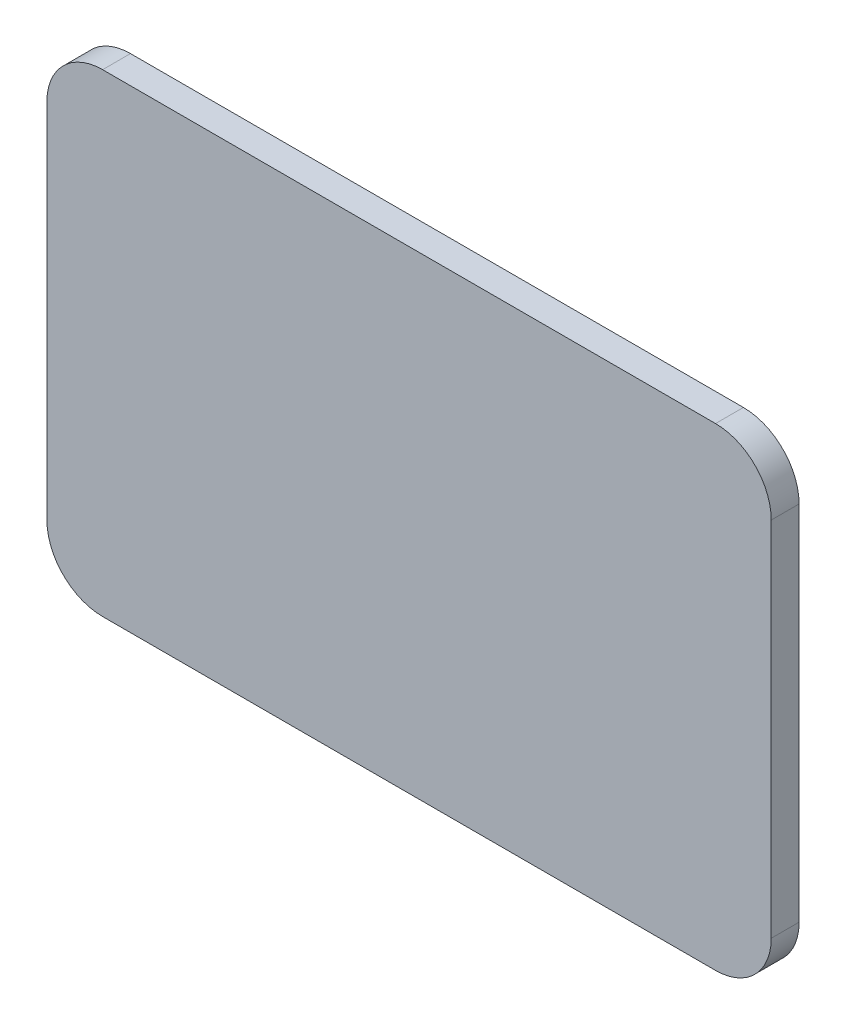
ISO-10303-21;
HEADER;
FILE_DESCRIPTION(('STEP AP214'),'2;1');
FILE_NAME('part.step','',(''),(''),'','','');
FILE_SCHEMA(('AUTOMOTIVE_DESIGN { 1 0 10303 214 1 1 1 1 }'));
ENDSEC;
DATA;
#1=APPLICATION_CONTEXT('core data for automotive mechanical design processes');
#2=APPLICATION_PROTOCOL_DEFINITION('international standard','automotive_design',2000,#1);
#3=PRODUCT_CONTEXT('',#1,'mechanical');
#4=PRODUCT('Part','Part','',(#3));
#5=PRODUCT_RELATED_PRODUCT_CATEGORY('part','',(#4));
#6=PRODUCT_DEFINITION_FORMATION('','',#4);
#7=PRODUCT_DEFINITION_CONTEXT('part definition',#1,'design');
#8=PRODUCT_DEFINITION('design','',#6,#7);
#9=PRODUCT_DEFINITION_SHAPE('','',#8);
#10=(LENGTH_UNIT() NAMED_UNIT(*) SI_UNIT(.MILLI.,.METRE.));
#11=(NAMED_UNIT(*) PLANE_ANGLE_UNIT() SI_UNIT($,.RADIAN.));
#12=(NAMED_UNIT(*) SI_UNIT($,.STERADIAN.) SOLID_ANGLE_UNIT());
#13=UNCERTAINTY_MEASURE_WITH_UNIT(LENGTH_MEASURE(1.E-05),#10,'distance_accuracy_value','');
#14=(GEOMETRIC_REPRESENTATION_CONTEXT(3) GLOBAL_UNCERTAINTY_ASSIGNED_CONTEXT((#13)) GLOBAL_UNIT_ASSIGNED_CONTEXT((#10,
#11,#12)) REPRESENTATION_CONTEXT('',''));
#15=CARTESIAN_POINT('',(0.,0.,0.));
#16=DIRECTION('',(0.,0.,1.));
#17=DIRECTION('',(1.,0.,0.));
#18=AXIS2_PLACEMENT_3D('',#15,#16,#17);
#19=CARTESIAN_POINT('',(0.,17.,1.));
#20=DIRECTION('',(1.,0.,0.));
#21=DIRECTION('',(0.,0.,-1.));
#22=AXIS2_PLACEMENT_3D('',#19,#20,#21);
#23=PLANE('',#22);
#24=DIRECTION('',(0.,-1.,0.));
#25=VECTOR('',#24,1.);
#26=CARTESIAN_POINT('',(0.,17.,1.));
#27=LINE('',#26,#25);
#28=CARTESIAN_POINT('',(0.,15.,1.));
#29=VERTEX_POINT('',#28);
#30=CARTESIAN_POINT('',(0.,2.,1.));
#31=VERTEX_POINT('',#30);
#32=EDGE_CURVE('E124',#29,#31,#27,.T.);
#33=ORIENTED_EDGE('',*,*,#32,.F.);
#34=DIRECTION('',(0.,0.,-1.));
#35=VECTOR('',#34,1.);
#36=CARTESIAN_POINT('',(0.,15.,1.));
#37=LINE('',#36,#35);
#38=CARTESIAN_POINT('',(0.,15.,0.));
#39=VERTEX_POINT('',#38);
#40=EDGE_CURVE('E109',#29,#39,#37,.T.);
#41=ORIENTED_EDGE('',*,*,#40,.T.);
#42=DIRECTION('',(0.,-1.,0.));
#43=VECTOR('',#42,1.);
#44=CARTESIAN_POINT('',(0.,17.,0.));
#45=LINE('',#44,#43);
#46=CARTESIAN_POINT('',(0.,2.,0.));
#47=VERTEX_POINT('',#46);
#48=EDGE_CURVE('E121',#39,#47,#45,.T.);
#49=ORIENTED_EDGE('',*,*,#48,.T.);
#50=DIRECTION('',(0.,0.,-1.));
#51=VECTOR('',#50,1.);
#52=CARTESIAN_POINT('',(0.,2.,1.));
#53=LINE('',#52,#51);
#54=EDGE_CURVE('E126',#47,#31,#53,.F.);
#55=ORIENTED_EDGE('',*,*,#54,.T.);
#56=EDGE_LOOP('',(#33,#41,#49,#55));
#57=FACE_BOUND('',#56,.T.);
#58=ADVANCED_FACE('F39',(#57),#23,.F.);
#59=CARTESIAN_POINT('',(0.,0.,1.));
#60=DIRECTION('',(0.,1.,0.));
#61=DIRECTION('',(0.,0.,1.));
#62=AXIS2_PLACEMENT_3D('',#59,#60,#61);
#63=PLANE('',#62);
#64=DIRECTION('',(1.,0.,0.));
#65=VECTOR('',#64,1.);
#66=CARTESIAN_POINT('',(0.,0.,0.));
#67=LINE('',#66,#65);
#68=CARTESIAN_POINT('',(2.,0.,0.));
#69=VERTEX_POINT('',#68);
#70=CARTESIAN_POINT('',(24.,0.,0.));
#71=VERTEX_POINT('',#70);
#72=EDGE_CURVE('E130',#69,#71,#67,.T.);
#73=ORIENTED_EDGE('',*,*,#72,.T.);
#74=DIRECTION('',(0.,0.,-1.));
#75=VECTOR('',#74,1.);
#76=CARTESIAN_POINT('',(24.,0.,1.));
#77=LINE('',#76,#75);
#78=CARTESIAN_POINT('',(24.,0.,1.));
#79=VERTEX_POINT('',#78);
#80=EDGE_CURVE('E11',#71,#79,#77,.F.);
#81=ORIENTED_EDGE('',*,*,#80,.T.);
#82=DIRECTION('',(1.,0.,0.));
#83=VECTOR('',#82,1.);
#84=CARTESIAN_POINT('',(0.,0.,1.));
#85=LINE('',#84,#83);
#86=CARTESIAN_POINT('',(2.,0.,1.));
#87=VERTEX_POINT('',#86);
#88=EDGE_CURVE('E166',#87,#79,#85,.T.);
#89=ORIENTED_EDGE('',*,*,#88,.F.);
#90=DIRECTION('',(0.,0.,-1.));
#91=VECTOR('',#90,1.);
#92=CARTESIAN_POINT('',(2.,0.,1.));
#93=LINE('',#92,#91);
#94=EDGE_CURVE('E47',#87,#69,#93,.T.);
#95=ORIENTED_EDGE('',*,*,#94,.T.);
#96=EDGE_LOOP('',(#73,#81,#89,#95));
#97=FACE_BOUND('',#96,.T.);
#98=ADVANCED_FACE('F164',(#97),#63,.F.);
#99=CARTESIAN_POINT('',(26.,0.,1.));
#100=DIRECTION('',(-1.,0.,0.));
#101=DIRECTION('',(0.,0.,1.));
#102=AXIS2_PLACEMENT_3D('',#99,#100,#101);
#103=PLANE('',#102);
#104=DIRECTION('',(0.,1.,0.));
#105=VECTOR('',#104,1.);
#106=CARTESIAN_POINT('',(26.,0.,0.));
#107=LINE('',#106,#105);
#108=CARTESIAN_POINT('',(26.,2.,0.));
#109=VERTEX_POINT('',#108);
#110=CARTESIAN_POINT('',(26.,15.,0.));
#111=VERTEX_POINT('',#110);
#112=EDGE_CURVE('E133',#109,#111,#107,.T.);
#113=ORIENTED_EDGE('',*,*,#112,.T.);
#114=DIRECTION('',(0.,0.,-1.));
#115=VECTOR('',#114,1.);
#116=CARTESIAN_POINT('',(26.,15.,1.));
#117=LINE('',#116,#115);
#118=CARTESIAN_POINT('',(26.,15.,1.));
#119=VERTEX_POINT('',#118);
#120=EDGE_CURVE('E54',#111,#119,#117,.F.);
#121=ORIENTED_EDGE('',*,*,#120,.T.);
#122=DIRECTION('',(0.,1.,0.));
#123=VECTOR('',#122,1.);
#124=CARTESIAN_POINT('',(26.,0.,1.));
#125=LINE('',#124,#123);
#126=CARTESIAN_POINT('',(26.,2.,1.));
#127=VERTEX_POINT('',#126);
#128=EDGE_CURVE('E174',#127,#119,#125,.T.);
#129=ORIENTED_EDGE('',*,*,#128,.F.);
#130=DIRECTION('',(0.,0.,-1.));
#131=VECTOR('',#130,1.);
#132=CARTESIAN_POINT('',(26.,2.,1.));
#133=LINE('',#132,#131);
#134=EDGE_CURVE('E157',#127,#109,#133,.T.);
#135=ORIENTED_EDGE('',*,*,#134,.T.);
#136=EDGE_LOOP('',(#113,#121,#129,#135));
#137=FACE_BOUND('',#136,.T.);
#138=ADVANCED_FACE('F173',(#137),#103,.F.);
#139=CARTESIAN_POINT('',(26.,17.,1.));
#140=DIRECTION('',(0.,-1.,0.));
#141=DIRECTION('',(0.,0.,-1.));
#142=AXIS2_PLACEMENT_3D('',#139,#140,#141);
#143=PLANE('',#142);
#144=DIRECTION('',(-1.,0.,0.));
#145=VECTOR('',#144,1.);
#146=CARTESIAN_POINT('',(26.,17.,0.));
#147=LINE('',#146,#145);
#148=CARTESIAN_POINT('',(24.,17.,0.));
#149=VERTEX_POINT('',#148);
#150=CARTESIAN_POINT('',(2.00000000000001,17.,0.));
#151=VERTEX_POINT('',#150);
#152=EDGE_CURVE('E140',#149,#151,#147,.T.);
#153=ORIENTED_EDGE('',*,*,#152,.T.);
#154=DIRECTION('',(0.,0.,-1.));
#155=VECTOR('',#154,1.);
#156=CARTESIAN_POINT('',(2.,17.,1.));
#157=LINE('',#156,#155);
#158=CARTESIAN_POINT('',(2.00000000000001,17.,1.));
#159=VERTEX_POINT('',#158);
#160=EDGE_CURVE('E110',#151,#159,#157,.F.);
#161=ORIENTED_EDGE('',*,*,#160,.T.);
#162=DIRECTION('',(-1.,0.,0.));
#163=VECTOR('',#162,1.);
#164=CARTESIAN_POINT('',(26.,17.,1.));
#165=LINE('',#164,#163);
#166=CARTESIAN_POINT('',(24.,17.,1.));
#167=VERTEX_POINT('',#166);
#168=EDGE_CURVE('E136',#167,#159,#165,.T.);
#169=ORIENTED_EDGE('',*,*,#168,.F.);
#170=DIRECTION('',(0.,0.,-1.));
#171=VECTOR('',#170,1.);
#172=CARTESIAN_POINT('',(24.,17.,1.));
#173=LINE('',#172,#171);
#174=EDGE_CURVE('E115',#167,#149,#173,.T.);
#175=ORIENTED_EDGE('',*,*,#174,.T.);
#176=EDGE_LOOP('',(#153,#161,#169,#175));
#177=FACE_BOUND('',#176,.T.);
#178=ADVANCED_FACE('F202',(#177),#143,.F.);
#179=CARTESIAN_POINT('',(0.,0.,1.));
#180=DIRECTION('',(0.,0.,1.));
#181=DIRECTION('',(1.,0.,0.));
#182=AXIS2_PLACEMENT_3D('',#179,#180,#181);
#183=PLANE('',#182);
#184=ORIENTED_EDGE('',*,*,#168,.T.);
#185=CARTESIAN_POINT('',(2.,15.,1.));
#186=DIRECTION('',(0.,0.,1.));
#187=DIRECTION('',(1.,0.,0.));
#188=AXIS2_PLACEMENT_3D('',#185,#186,#187);
#189=CIRCLE('',#188,2.);
#190=EDGE_CURVE('E155',#159,#29,#189,.T.);
#191=ORIENTED_EDGE('',*,*,#190,.T.);
#192=ORIENTED_EDGE('',*,*,#32,.T.);
#193=CARTESIAN_POINT('',(2.,2.,1.));
#194=DIRECTION('',(0.,0.,1.));
#195=DIRECTION('',(1.,0.,0.));
#196=AXIS2_PLACEMENT_3D('',#193,#194,#195);
#197=CIRCLE('',#196,2.);
#198=EDGE_CURVE('E150',#31,#87,#197,.T.);
#199=ORIENTED_EDGE('',*,*,#198,.T.);
#200=ORIENTED_EDGE('',*,*,#88,.T.);
#201=CARTESIAN_POINT('',(24.,2.,1.));
#202=DIRECTION('',(0.,0.,1.));
#203=DIRECTION('',(1.,0.,0.));
#204=AXIS2_PLACEMENT_3D('',#201,#202,#203);
#205=CIRCLE('',#204,2.);
#206=EDGE_CURVE('E61',#79,#127,#205,.T.);
#207=ORIENTED_EDGE('',*,*,#206,.T.);
#208=ORIENTED_EDGE('',*,*,#128,.T.);
#209=CARTESIAN_POINT('',(24.,15.,1.));
#210=DIRECTION('',(0.,0.,1.));
#211=DIRECTION('',(1.,0.,0.));
#212=AXIS2_PLACEMENT_3D('',#209,#210,#211);
#213=CIRCLE('',#212,2.);
#214=EDGE_CURVE('E153',#119,#167,#213,.T.);
#215=ORIENTED_EDGE('',*,*,#214,.T.);
#216=EDGE_LOOP('',(#184,#191,#192,#199,#200,#207,#208,#215));
#217=FACE_BOUND('',#216,.T.);
#218=ADVANCED_FACE('F179',(#217),#183,.T.);
#219=CARTESIAN_POINT('',(0.,0.,0.));
#220=DIRECTION('',(0.,0.,1.));
#221=DIRECTION('',(1.,0.,0.));
#222=AXIS2_PLACEMENT_3D('',#219,#220,#221);
#223=PLANE('',#222);
#224=ORIENTED_EDGE('',*,*,#48,.F.);
#225=CARTESIAN_POINT('',(2.,15.,0.));
#226=DIRECTION('',(0.,0.,1.));
#227=DIRECTION('',(1.,0.,0.));
#228=AXIS2_PLACEMENT_3D('',#225,#226,#227);
#229=CIRCLE('',#228,2.);
#230=EDGE_CURVE('E105',#39,#151,#229,.F.);
#231=ORIENTED_EDGE('',*,*,#230,.T.);
#232=ORIENTED_EDGE('',*,*,#152,.F.);
#233=CARTESIAN_POINT('',(24.,15.,0.));
#234=DIRECTION('',(0.,0.,1.));
#235=DIRECTION('',(1.,0.,0.));
#236=AXIS2_PLACEMENT_3D('',#233,#234,#235);
#237=CIRCLE('',#236,2.);
#238=EDGE_CURVE('E116',#149,#111,#237,.F.);
#239=ORIENTED_EDGE('',*,*,#238,.T.);
#240=ORIENTED_EDGE('',*,*,#112,.F.);
#241=CARTESIAN_POINT('',(24.,2.,0.));
#242=DIRECTION('',(0.,0.,1.));
#243=DIRECTION('',(1.,0.,0.));
#244=AXIS2_PLACEMENT_3D('',#241,#242,#243);
#245=CIRCLE('',#244,2.);
#246=EDGE_CURVE('E144',#109,#71,#245,.F.);
#247=ORIENTED_EDGE('',*,*,#246,.T.);
#248=ORIENTED_EDGE('',*,*,#72,.F.);
#249=CARTESIAN_POINT('',(2.,2.,0.));
#250=DIRECTION('',(0.,0.,1.));
#251=DIRECTION('',(1.,0.,0.));
#252=AXIS2_PLACEMENT_3D('',#249,#250,#251);
#253=CIRCLE('',#252,2.);
#254=EDGE_CURVE('E125',#69,#47,#253,.F.);
#255=ORIENTED_EDGE('',*,*,#254,.T.);
#256=EDGE_LOOP('',(#224,#231,#232,#239,#240,#247,#248,#255));
#257=FACE_BOUND('',#256,.T.);
#258=ADVANCED_FACE('F128',(#257),#223,.F.);
#259=CARTESIAN_POINT('',(2.,15.,1.));
#260=DIRECTION('',(0.,0.,-1.));
#261=DIRECTION('',(-1.,0.,0.));
#262=AXIS2_PLACEMENT_3D('',#259,#260,#261);
#263=CYLINDRICAL_SURFACE('',#262,2.);
#264=ORIENTED_EDGE('',*,*,#190,.F.);
#265=ORIENTED_EDGE('',*,*,#160,.F.);
#266=ORIENTED_EDGE('',*,*,#230,.F.);
#267=ORIENTED_EDGE('',*,*,#40,.F.);
#268=EDGE_LOOP('',(#264,#265,#266,#267));
#269=FACE_BOUND('',#268,.T.);
#270=ADVANCED_FACE('F108',(#269),#263,.T.);
#271=CARTESIAN_POINT('',(24.,15.,1.));
#272=DIRECTION('',(0.,0.,-1.));
#273=DIRECTION('',(-1.,0.,0.));
#274=AXIS2_PLACEMENT_3D('',#271,#272,#273);
#275=CYLINDRICAL_SURFACE('',#274,2.);
#276=ORIENTED_EDGE('',*,*,#214,.F.);
#277=ORIENTED_EDGE('',*,*,#120,.F.);
#278=ORIENTED_EDGE('',*,*,#238,.F.);
#279=ORIENTED_EDGE('',*,*,#174,.F.);
#280=EDGE_LOOP('',(#276,#277,#278,#279));
#281=FACE_BOUND('',#280,.T.);
#282=ADVANCED_FACE('F184',(#281),#275,.T.);
#283=CARTESIAN_POINT('',(24.,2.,1.));
#284=DIRECTION('',(0.,0.,-1.));
#285=DIRECTION('',(-1.,0.,0.));
#286=AXIS2_PLACEMENT_3D('',#283,#284,#285);
#287=CYLINDRICAL_SURFACE('',#286,2.);
#288=ORIENTED_EDGE('',*,*,#206,.F.);
#289=ORIENTED_EDGE('',*,*,#80,.F.);
#290=ORIENTED_EDGE('',*,*,#246,.F.);
#291=ORIENTED_EDGE('',*,*,#134,.F.);
#292=EDGE_LOOP('',(#288,#289,#290,#291));
#293=FACE_BOUND('',#292,.T.);
#294=ADVANCED_FACE('F172',(#293),#287,.T.);
#295=CARTESIAN_POINT('',(2.,2.,1.));
#296=DIRECTION('',(0.,0.,-1.));
#297=DIRECTION('',(-1.,0.,0.));
#298=AXIS2_PLACEMENT_3D('',#295,#296,#297);
#299=CYLINDRICAL_SURFACE('',#298,2.);
#300=ORIENTED_EDGE('',*,*,#198,.F.);
#301=ORIENTED_EDGE('',*,*,#54,.F.);
#302=ORIENTED_EDGE('',*,*,#254,.F.);
#303=ORIENTED_EDGE('',*,*,#94,.F.);
#304=EDGE_LOOP('',(#300,#301,#302,#303));
#305=FACE_BOUND('',#304,.T.);
#306=ADVANCED_FACE('F41',(#305),#299,.T.);
#307=CLOSED_SHELL('',(#58,#98,#138,#178,#218,#258,#270,#282,#294,#306));
#308=MANIFOLD_SOLID_BREP('B2',#307);
#309=ADVANCED_BREP_SHAPE_REPRESENTATION('',(#18,#308),#14);
#310=SHAPE_DEFINITION_REPRESENTATION(#9,#309);
ENDSEC;
END-ISO-10303-21;
